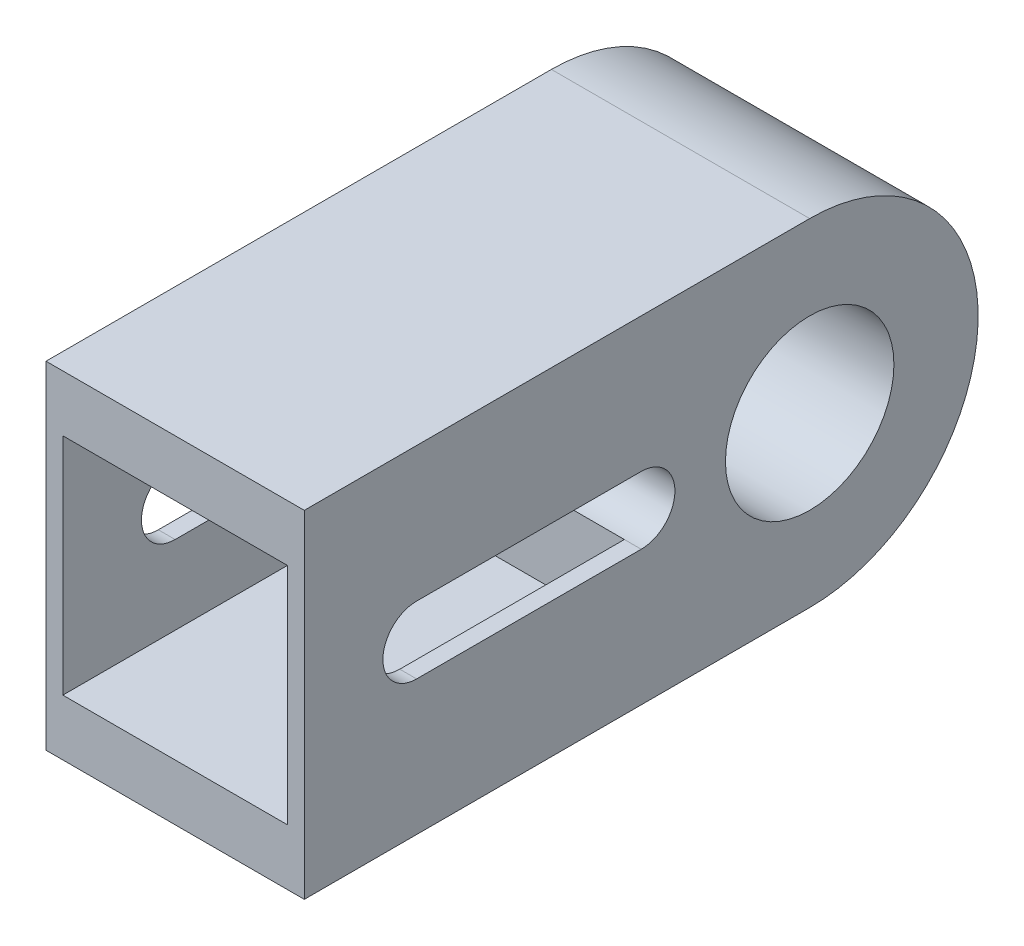
ISO-10303-21;
HEADER;
FILE_DESCRIPTION(('STEP AP214'),'2;1');
FILE_NAME('part.step','',(''),(''),'','','');
FILE_SCHEMA(('AUTOMOTIVE_DESIGN { 1 0 10303 214 1 1 1 1 }'));
ENDSEC;
DATA;
#1=APPLICATION_CONTEXT('core data for automotive mechanical design processes');
#2=APPLICATION_PROTOCOL_DEFINITION('international standard','automotive_design',2000,#1);
#3=PRODUCT_CONTEXT('',#1,'mechanical');
#4=PRODUCT('Part','Part','',(#3));
#5=PRODUCT_RELATED_PRODUCT_CATEGORY('part','',(#4));
#6=PRODUCT_DEFINITION_FORMATION('','',#4);
#7=PRODUCT_DEFINITION_CONTEXT('part definition',#1,'design');
#8=PRODUCT_DEFINITION('design','',#6,#7);
#9=PRODUCT_DEFINITION_SHAPE('','',#8);
#10=(LENGTH_UNIT() NAMED_UNIT(*) SI_UNIT(.MILLI.,.METRE.));
#11=(NAMED_UNIT(*) PLANE_ANGLE_UNIT() SI_UNIT($,.RADIAN.));
#12=(NAMED_UNIT(*) SI_UNIT($,.STERADIAN.) SOLID_ANGLE_UNIT());
#13=UNCERTAINTY_MEASURE_WITH_UNIT(LENGTH_MEASURE(1.E-05),#10,'distance_accuracy_value','');
#14=(GEOMETRIC_REPRESENTATION_CONTEXT(3) GLOBAL_UNCERTAINTY_ASSIGNED_CONTEXT((#13)) GLOBAL_UNIT_ASSIGNED_CONTEXT((#10,
#11,#12)) REPRESENTATION_CONTEXT('',''));
#15=CARTESIAN_POINT('',(0.,0.,0.));
#16=DIRECTION('',(0.,0.,1.));
#17=DIRECTION('',(1.,0.,0.));
#18=AXIS2_PLACEMENT_3D('',#15,#16,#17);
#19=CARTESIAN_POINT('',(-23.,0.,14.9535809018568));
#20=DIRECTION('',(1.,0.,0.));
#21=DIRECTION('',(0.,0.,-1.));
#22=AXIS2_PLACEMENT_3D('',#19,#20,#21);
#23=CYLINDRICAL_SURFACE('',#22,3.);
#24=DIRECTION('',(1.,0.,0.));
#25=VECTOR('',#24,1.);
#26=CARTESIAN_POINT('',(-23.,-3.,14.9535809018568));
#27=LINE('',#26,#25);
#28=CARTESIAN_POINT('',(-1.5,-3.,14.9535809018568));
#29=VERTEX_POINT('',#28);
#30=CARTESIAN_POINT('',(0.,-3.,14.9535809018568));
#31=VERTEX_POINT('',#30);
#32=EDGE_CURVE('E251',#29,#31,#27,.T.);
#33=ORIENTED_EDGE('',*,*,#32,.F.);
#34=CARTESIAN_POINT('',(-1.5,0.,14.9535809018568));
#35=DIRECTION('',(1.,0.,0.));
#36=DIRECTION('',(0.,1.,0.));
#37=AXIS2_PLACEMENT_3D('',#34,#35,#36);
#38=CIRCLE('',#37,3.);
#39=CARTESIAN_POINT('',(-1.5,3.,14.9535809018568));
#40=VERTEX_POINT('',#39);
#41=EDGE_CURVE('E218',#29,#40,#38,.F.);
#42=ORIENTED_EDGE('',*,*,#41,.T.);
#43=DIRECTION('',(1.,0.,0.));
#44=VECTOR('',#43,1.);
#45=CARTESIAN_POINT('',(-23.,3.,14.9535809018568));
#46=LINE('',#45,#44);
#47=CARTESIAN_POINT('',(0.,3.,14.9535809018568));
#48=VERTEX_POINT('',#47);
#49=EDGE_CURVE('E271',#40,#48,#46,.T.);
#50=ORIENTED_EDGE('',*,*,#49,.T.);
#51=CARTESIAN_POINT('',(0.,0.,14.9535809018568));
#52=DIRECTION('',(1.,0.,0.));
#53=DIRECTION('',(0.,0.,-1.));
#54=AXIS2_PLACEMENT_3D('',#51,#52,#53);
#55=CIRCLE('',#54,3.);
#56=EDGE_CURVE('E230',#48,#31,#55,.T.);
#57=ORIENTED_EDGE('',*,*,#56,.T.);
#58=EDGE_LOOP('',(#33,#42,#50,#57));
#59=FACE_BOUND('',#58,.T.);
#60=ADVANCED_FACE('F39',(#59),#23,.F.);
#61=CARTESIAN_POINT('',(-23.,3.,14.9535809018568));
#62=DIRECTION('',(0.,1.,0.));
#63=DIRECTION('',(0.,0.,1.));
#64=AXIS2_PLACEMENT_3D('',#61,#62,#63);
#65=PLANE('',#64);
#66=ORIENTED_EDGE('',*,*,#49,.F.);
#67=DIRECTION('',(0.,0.,-1.));
#68=VECTOR('',#67,1.);
#69=CARTESIAN_POINT('',(-1.5,3.,14.9535809018568));
#70=LINE('',#69,#68);
#71=CARTESIAN_POINT('',(-1.5,3.,-5.04641909814324));
#72=VERTEX_POINT('',#71);
#73=EDGE_CURVE('E222',#40,#72,#70,.T.);
#74=ORIENTED_EDGE('',*,*,#73,.T.);
#75=DIRECTION('',(1.,0.,0.));
#76=VECTOR('',#75,1.);
#77=CARTESIAN_POINT('',(-23.,3.,-5.04641909814324));
#78=LINE('',#77,#76);
#79=CARTESIAN_POINT('',(0.,3.,-5.04641909814324));
#80=VERTEX_POINT('',#79);
#81=EDGE_CURVE('E276',#72,#80,#78,.T.);
#82=ORIENTED_EDGE('',*,*,#81,.T.);
#83=DIRECTION('',(0.,0.,1.));
#84=VECTOR('',#83,1.);
#85=CARTESIAN_POINT('',(0.,3.,14.9535809018568));
#86=LINE('',#85,#84);
#87=EDGE_CURVE('E239',#80,#48,#86,.T.);
#88=ORIENTED_EDGE('',*,*,#87,.T.);
#89=EDGE_LOOP('',(#66,#74,#82,#88));
#90=FACE_BOUND('',#89,.T.);
#91=ADVANCED_FACE('F352',(#90),#65,.F.);
#92=CARTESIAN_POINT('',(-23.,-3.,14.9535809018568));
#93=DIRECTION('',(0.,-1.,0.));
#94=DIRECTION('',(0.,0.,-1.));
#95=AXIS2_PLACEMENT_3D('',#92,#93,#94);
#96=PLANE('',#95);
#97=DIRECTION('',(1.,0.,0.));
#98=VECTOR('',#97,1.);
#99=CARTESIAN_POINT('',(-23.,-3.,-5.04641909814324));
#100=LINE('',#99,#98);
#101=CARTESIAN_POINT('',(-1.5,-3.,-5.04641909814324));
#102=VERTEX_POINT('',#101);
#103=CARTESIAN_POINT('',(0.,-3.,-5.04641909814324));
#104=VERTEX_POINT('',#103);
#105=EDGE_CURVE('E282',#102,#104,#100,.T.);
#106=ORIENTED_EDGE('',*,*,#105,.F.);
#107=DIRECTION('',(0.,0.,1.));
#108=VECTOR('',#107,1.);
#109=CARTESIAN_POINT('',(-1.5,-3.,14.9535809018568));
#110=LINE('',#109,#108);
#111=EDGE_CURVE('E11',#102,#29,#110,.T.);
#112=ORIENTED_EDGE('',*,*,#111,.T.);
#113=ORIENTED_EDGE('',*,*,#32,.T.);
#114=DIRECTION('',(0.,0.,-1.));
#115=VECTOR('',#114,1.);
#116=CARTESIAN_POINT('',(0.,-3.,14.9535809018568));
#117=LINE('',#116,#115);
#118=EDGE_CURVE('E255',#31,#104,#117,.T.);
#119=ORIENTED_EDGE('',*,*,#118,.T.);
#120=EDGE_LOOP('',(#106,#112,#113,#119));
#121=FACE_BOUND('',#120,.T.);
#122=ADVANCED_FACE('F362',(#121),#96,.F.);
#123=CARTESIAN_POINT('',(-23.,15.,24.9535809018568));
#124=DIRECTION('',(0.,0.,1.));
#125=DIRECTION('',(0.,-1.,0.));
#126=AXIS2_PLACEMENT_3D('',#123,#124,#125);
#127=PLANE('',#126);
#128=DIRECTION('',(0.,1.,0.));
#129=VECTOR('',#128,1.);
#130=CARTESIAN_POINT('',(-1.5,10.,24.9535809018568));
#131=LINE('',#130,#129);
#132=CARTESIAN_POINT('',(-1.5,-10.,24.9535809018568));
#133=VERTEX_POINT('',#132);
#134=CARTESIAN_POINT('',(-1.5,10.,24.9535809018568));
#135=VERTEX_POINT('',#134);
#136=EDGE_CURVE('E55',#133,#135,#131,.T.);
#137=ORIENTED_EDGE('',*,*,#136,.F.);
#138=DIRECTION('',(1.,0.,0.));
#139=VECTOR('',#138,1.);
#140=CARTESIAN_POINT('',(-21.5,-10.,24.9535809018568));
#141=LINE('',#140,#139);
#142=CARTESIAN_POINT('',(-21.5,-10.,24.9535809018568));
#143=VERTEX_POINT('',#142);
#144=EDGE_CURVE('E164',#143,#133,#141,.T.);
#145=ORIENTED_EDGE('',*,*,#144,.F.);
#146=DIRECTION('',(0.,-1.,0.));
#147=VECTOR('',#146,1.);
#148=CARTESIAN_POINT('',(-21.5,10.,24.9535809018568));
#149=LINE('',#148,#147);
#150=CARTESIAN_POINT('',(-21.5,10.,24.9535809018568));
#151=VERTEX_POINT('',#150);
#152=EDGE_CURVE('E193',#151,#143,#149,.T.);
#153=ORIENTED_EDGE('',*,*,#152,.F.);
#154=DIRECTION('',(-1.,0.,0.));
#155=VECTOR('',#154,1.);
#156=CARTESIAN_POINT('',(-21.5,10.,24.9535809018568));
#157=LINE('',#156,#155);
#158=EDGE_CURVE('E190',#135,#151,#157,.T.);
#159=ORIENTED_EDGE('',*,*,#158,.F.);
#160=EDGE_LOOP('',(#137,#145,#153,#159));
#161=FACE_BOUND('',#160,.T.);
#162=DIRECTION('',(0.,-1.,0.));
#163=VECTOR('',#162,1.);
#164=CARTESIAN_POINT('',(0.,15.,24.9535809018568));
#165=LINE('',#164,#163);
#166=CARTESIAN_POINT('',(0.,15.,24.9535809018568));
#167=VERTEX_POINT('',#166);
#168=CARTESIAN_POINT('',(0.,-15.,24.9535809018568));
#169=VERTEX_POINT('',#168);
#170=EDGE_CURVE('E270',#167,#169,#165,.T.);
#171=ORIENTED_EDGE('',*,*,#170,.F.);
#172=DIRECTION('',(1.,0.,0.));
#173=VECTOR('',#172,1.);
#174=CARTESIAN_POINT('',(-23.,15.,24.9535809018568));
#175=LINE('',#174,#173);
#176=CARTESIAN_POINT('',(-23.,15.,24.9535809018568));
#177=VERTEX_POINT('',#176);
#178=EDGE_CURVE('E319',#177,#167,#175,.T.);
#179=ORIENTED_EDGE('',*,*,#178,.F.);
#180=DIRECTION('',(0.,-1.,0.));
#181=VECTOR('',#180,1.);
#182=CARTESIAN_POINT('',(-23.,15.,24.9535809018568));
#183=LINE('',#182,#181);
#184=CARTESIAN_POINT('',(-23.,-15.,24.9535809018568));
#185=VERTEX_POINT('',#184);
#186=EDGE_CURVE('E287',#177,#185,#183,.T.);
#187=ORIENTED_EDGE('',*,*,#186,.T.);
#188=DIRECTION('',(1.,0.,0.));
#189=VECTOR('',#188,1.);
#190=CARTESIAN_POINT('',(-23.,-15.,24.9535809018568));
#191=LINE('',#190,#189);
#192=EDGE_CURVE('E304',#185,#169,#191,.T.);
#193=ORIENTED_EDGE('',*,*,#192,.T.);
#194=EDGE_LOOP('',(#171,#179,#187,#193));
#195=FACE_BOUND('',#194,.T.);
#196=ADVANCED_FACE('F41',(#161,#195),#127,.T.);
#197=CARTESIAN_POINT('',(-23.,15.,24.9535809018568));
#198=DIRECTION('',(0.,1.,0.));
#199=DIRECTION('',(0.,0.,1.));
#200=AXIS2_PLACEMENT_3D('',#197,#198,#199);
#201=PLANE('',#200);
#202=DIRECTION('',(0.,0.,1.));
#203=VECTOR('',#202,1.);
#204=CARTESIAN_POINT('',(0.,15.,24.9535809018568));
#205=LINE('',#204,#203);
#206=CARTESIAN_POINT('',(0.,15.,-20.0464190981432));
#207=VERTEX_POINT('',#206);
#208=EDGE_CURVE('E292',#207,#167,#205,.T.);
#209=ORIENTED_EDGE('',*,*,#208,.F.);
#210=DIRECTION('',(1.,0.,0.));
#211=VECTOR('',#210,1.);
#212=CARTESIAN_POINT('',(-23.,15.,-20.0464190981432));
#213=LINE('',#212,#211);
#214=CARTESIAN_POINT('',(-23.,15.,-20.0464190981432));
#215=VERTEX_POINT('',#214);
#216=EDGE_CURVE('E322',#215,#207,#213,.T.);
#217=ORIENTED_EDGE('',*,*,#216,.F.);
#218=DIRECTION('',(0.,0.,1.));
#219=VECTOR('',#218,1.);
#220=CARTESIAN_POINT('',(-23.,15.,24.9535809018568));
#221=LINE('',#220,#219);
#222=EDGE_CURVE('E300',#215,#177,#221,.T.);
#223=ORIENTED_EDGE('',*,*,#222,.T.);
#224=ORIENTED_EDGE('',*,*,#178,.T.);
#225=EDGE_LOOP('',(#209,#217,#223,#224));
#226=FACE_BOUND('',#225,.T.);
#227=ADVANCED_FACE('F378',(#226),#201,.T.);
#228=CARTESIAN_POINT('',(-23.,0.,-20.0464190981432));
#229=DIRECTION('',(1.,0.,0.));
#230=DIRECTION('',(0.,0.,-1.));
#231=AXIS2_PLACEMENT_3D('',#228,#229,#230);
#232=CYLINDRICAL_SURFACE('',#231,15.);
#233=CARTESIAN_POINT('',(0.,0.,-20.0464190981432));
#234=DIRECTION('',(1.,0.,0.));
#235=DIRECTION('',(0.,0.,-1.));
#236=AXIS2_PLACEMENT_3D('',#233,#234,#235);
#237=CIRCLE('',#236,15.);
#238=CARTESIAN_POINT('',(0.,-15.,-20.0464190981432));
#239=VERTEX_POINT('',#238);
#240=EDGE_CURVE('E312',#239,#207,#237,.T.);
#241=ORIENTED_EDGE('',*,*,#240,.F.);
#242=DIRECTION('',(1.,0.,0.));
#243=VECTOR('',#242,1.);
#244=CARTESIAN_POINT('',(-23.,-15.,-20.0464190981432));
#245=LINE('',#244,#243);
#246=CARTESIAN_POINT('',(-23.,-15.,-20.0464190981432));
#247=VERTEX_POINT('',#246);
#248=EDGE_CURVE('E325',#247,#239,#245,.T.);
#249=ORIENTED_EDGE('',*,*,#248,.F.);
#250=CARTESIAN_POINT('',(-23.,0.,-20.0464190981432));
#251=DIRECTION('',(1.,0.,0.));
#252=DIRECTION('',(0.,0.,-1.));
#253=AXIS2_PLACEMENT_3D('',#250,#251,#252);
#254=CIRCLE('',#253,15.);
#255=EDGE_CURVE('E296',#247,#215,#254,.T.);
#256=ORIENTED_EDGE('',*,*,#255,.T.);
#257=ORIENTED_EDGE('',*,*,#216,.T.);
#258=EDGE_LOOP('',(#241,#249,#256,#257));
#259=FACE_BOUND('',#258,.T.);
#260=ADVANCED_FACE('F381',(#259),#232,.T.);
#261=CARTESIAN_POINT('',(-23.,-15.,24.9535809018568));
#262=DIRECTION('',(0.,-1.,0.));
#263=DIRECTION('',(0.,0.,-1.));
#264=AXIS2_PLACEMENT_3D('',#261,#262,#263);
#265=PLANE('',#264);
#266=DIRECTION('',(0.,0.,-1.));
#267=VECTOR('',#266,1.);
#268=CARTESIAN_POINT('',(0.,-15.,24.9535809018568));
#269=LINE('',#268,#267);
#270=EDGE_CURVE('E308',#169,#239,#269,.T.);
#271=ORIENTED_EDGE('',*,*,#270,.F.);
#272=ORIENTED_EDGE('',*,*,#192,.F.);
#273=DIRECTION('',(0.,0.,-1.));
#274=VECTOR('',#273,1.);
#275=CARTESIAN_POINT('',(-23.,-15.,24.9535809018568));
#276=LINE('',#275,#274);
#277=EDGE_CURVE('E291',#185,#247,#276,.T.);
#278=ORIENTED_EDGE('',*,*,#277,.T.);
#279=ORIENTED_EDGE('',*,*,#248,.T.);
#280=EDGE_LOOP('',(#271,#272,#278,#279));
#281=FACE_BOUND('',#280,.T.);
#282=ADVANCED_FACE('F373',(#281),#265,.T.);
#283=CARTESIAN_POINT('',(-23.,0.,-20.0464190981432));
#284=DIRECTION('',(1.,0.,0.));
#285=DIRECTION('',(0.,0.,-1.));
#286=AXIS2_PLACEMENT_3D('',#283,#284,#285);
#287=PLANE('',#286);
#288=CARTESIAN_POINT('',(-23.,0.,-20.0464190981432));
#289=DIRECTION('',(1.,0.,0.));
#290=DIRECTION('',(0.,0.,-1.));
#291=AXIS2_PLACEMENT_3D('',#288,#289,#290);
#292=CIRCLE('',#291,7.5);
#293=CARTESIAN_POINT('',(-23.,0.,-27.5464190981432));
#294=VERTEX_POINT('',#293);
#295=EDGE_CURVE('E226',#294,#294,#292,.T.);
#296=ORIENTED_EDGE('',*,*,#295,.T.);
#297=EDGE_LOOP('',(#296));
#298=FACE_BOUND('',#297,.T.);
#299=DIRECTION('',(0.,0.,1.));
#300=VECTOR('',#299,1.);
#301=CARTESIAN_POINT('',(-23.,3.,14.9535809018568));
#302=LINE('',#301,#300);
#303=CARTESIAN_POINT('',(-23.,3.,-5.04641909814324));
#304=VERTEX_POINT('',#303);
#305=CARTESIAN_POINT('',(-23.,3.,14.9535809018568));
#306=VERTEX_POINT('',#305);
#307=EDGE_CURVE('E247',#304,#306,#302,.T.);
#308=ORIENTED_EDGE('',*,*,#307,.T.);
#309=CARTESIAN_POINT('',(-23.,0.,14.9535809018568));
#310=DIRECTION('',(1.,0.,0.));
#311=DIRECTION('',(0.,0.,-1.));
#312=AXIS2_PLACEMENT_3D('',#309,#310,#311);
#313=CIRCLE('',#312,3.);
#314=CARTESIAN_POINT('',(-23.,-3.,14.9535809018568));
#315=VERTEX_POINT('',#314);
#316=EDGE_CURVE('E234',#306,#315,#313,.T.);
#317=ORIENTED_EDGE('',*,*,#316,.T.);
#318=DIRECTION('',(0.,0.,-1.));
#319=VECTOR('',#318,1.);
#320=CARTESIAN_POINT('',(-23.,-3.,14.9535809018568));
#321=LINE('',#320,#319);
#322=CARTESIAN_POINT('',(-23.,-3.,-5.04641909814324));
#323=VERTEX_POINT('',#322);
#324=EDGE_CURVE('E238',#315,#323,#321,.T.);
#325=ORIENTED_EDGE('',*,*,#324,.T.);
#326=CARTESIAN_POINT('',(-23.,0.,-5.04641909814324));
#327=DIRECTION('',(1.,0.,0.));
#328=DIRECTION('',(0.,0.,-1.));
#329=AXIS2_PLACEMENT_3D('',#326,#327,#328);
#330=CIRCLE('',#329,3.);
#331=EDGE_CURVE('E243',#323,#304,#330,.T.);
#332=ORIENTED_EDGE('',*,*,#331,.T.);
#333=EDGE_LOOP('',(#308,#317,#325,#332));
#334=FACE_BOUND('',#333,.T.);
#335=ORIENTED_EDGE('',*,*,#186,.F.);
#336=ORIENTED_EDGE('',*,*,#222,.F.);
#337=ORIENTED_EDGE('',*,*,#255,.F.);
#338=ORIENTED_EDGE('',*,*,#277,.F.);
#339=EDGE_LOOP('',(#335,#336,#337,#338));
#340=FACE_BOUND('',#339,.T.);
#341=ADVANCED_FACE('F342',(#298,#334,#340),#287,.F.);
#342=CARTESIAN_POINT('',(0.,0.,-20.0464190981432));
#343=DIRECTION('',(1.,0.,0.));
#344=DIRECTION('',(0.,0.,-1.));
#345=AXIS2_PLACEMENT_3D('',#342,#343,#344);
#346=PLANE('',#345);
#347=CARTESIAN_POINT('',(0.,0.,-20.0464190981432));
#348=DIRECTION('',(1.,0.,0.));
#349=DIRECTION('',(0.,0.,-1.));
#350=AXIS2_PLACEMENT_3D('',#347,#348,#349);
#351=CIRCLE('',#350,7.5);
#352=CARTESIAN_POINT('',(0.,0.,-27.5464190981432));
#353=VERTEX_POINT('',#352);
#354=EDGE_CURVE('E225',#353,#353,#351,.T.);
#355=ORIENTED_EDGE('',*,*,#354,.F.);
#356=EDGE_LOOP('',(#355));
#357=FACE_BOUND('',#356,.T.);
#358=ORIENTED_EDGE('',*,*,#56,.F.);
#359=ORIENTED_EDGE('',*,*,#87,.F.);
#360=CARTESIAN_POINT('',(0.,0.,-5.04641909814324));
#361=DIRECTION('',(1.,0.,0.));
#362=DIRECTION('',(0.,0.,-1.));
#363=AXIS2_PLACEMENT_3D('',#360,#361,#362);
#364=CIRCLE('',#363,3.);
#365=EDGE_CURVE('E259',#104,#80,#364,.T.);
#366=ORIENTED_EDGE('',*,*,#365,.F.);
#367=ORIENTED_EDGE('',*,*,#118,.F.);
#368=EDGE_LOOP('',(#358,#359,#366,#367));
#369=FACE_BOUND('',#368,.T.);
#370=ORIENTED_EDGE('',*,*,#170,.T.);
#371=ORIENTED_EDGE('',*,*,#270,.T.);
#372=ORIENTED_EDGE('',*,*,#240,.T.);
#373=ORIENTED_EDGE('',*,*,#208,.T.);
#374=EDGE_LOOP('',(#370,#371,#372,#373));
#375=FACE_BOUND('',#374,.T.);
#376=ADVANCED_FACE('F358',(#357,#369,#375),#346,.T.);
#377=CARTESIAN_POINT('',(-21.5,3.,14.9535809018568));
#378=VERTEX_POINT('',#377);
#379=EDGE_CURVE('E266',#306,#378,#46,.T.);
#380=ORIENTED_EDGE('',*,*,#379,.T.);
#381=CARTESIAN_POINT('',(-21.5,0.,14.9535809018568));
#382=DIRECTION('',(-1.,0.,0.));
#383=DIRECTION('',(0.,-1.,0.));
#384=AXIS2_PLACEMENT_3D('',#381,#382,#383);
#385=CIRCLE('',#384,3.);
#386=CARTESIAN_POINT('',(-21.5,-3.,14.9535809018568));
#387=VERTEX_POINT('',#386);
#388=EDGE_CURVE('E210',#378,#387,#385,.F.);
#389=ORIENTED_EDGE('',*,*,#388,.T.);
#390=EDGE_CURVE('E283',#315,#387,#27,.T.);
#391=ORIENTED_EDGE('',*,*,#390,.F.);
#392=ORIENTED_EDGE('',*,*,#316,.F.);
#393=EDGE_LOOP('',(#380,#389,#391,#392));
#394=FACE_BOUND('',#393,.T.);
#395=ADVANCED_FACE('F346',(#394),#23,.F.);
#396=CARTESIAN_POINT('',(-21.5,3.,-5.04641909814324));
#397=VERTEX_POINT('',#396);
#398=EDGE_CURVE('E272',#304,#397,#78,.T.);
#399=ORIENTED_EDGE('',*,*,#398,.T.);
#400=DIRECTION('',(0.,0.,1.));
#401=VECTOR('',#400,1.);
#402=CARTESIAN_POINT('',(-21.5,3.,14.9535809018568));
#403=LINE('',#402,#401);
#404=EDGE_CURVE('E214',#397,#378,#403,.T.);
#405=ORIENTED_EDGE('',*,*,#404,.T.);
#406=ORIENTED_EDGE('',*,*,#379,.F.);
#407=ORIENTED_EDGE('',*,*,#307,.F.);
#408=EDGE_LOOP('',(#399,#405,#406,#407));
#409=FACE_BOUND('',#408,.T.);
#410=ADVANCED_FACE('F349',(#409),#65,.F.);
#411=CARTESIAN_POINT('',(-23.,0.,-5.04641909814324));
#412=DIRECTION('',(1.,0.,0.));
#413=DIRECTION('',(0.,0.,-1.));
#414=AXIS2_PLACEMENT_3D('',#411,#412,#413);
#415=CYLINDRICAL_SURFACE('',#414,3.);
#416=ORIENTED_EDGE('',*,*,#365,.T.);
#417=ORIENTED_EDGE('',*,*,#81,.F.);
#418=DIRECTION('',(1.,0.,0.));
#419=VECTOR('',#418,1.);
#420=CARTESIAN_POINT('',(-23.,3.,-5.04641909814324));
#421=LINE('',#420,#419);
#422=EDGE_CURVE('E161',#397,#72,#421,.T.);
#423=ORIENTED_EDGE('',*,*,#422,.F.);
#424=ORIENTED_EDGE('',*,*,#398,.F.);
#425=ORIENTED_EDGE('',*,*,#331,.F.);
#426=CARTESIAN_POINT('',(-21.5,-3.,-5.04641909814324));
#427=VERTEX_POINT('',#426);
#428=EDGE_CURVE('E277',#323,#427,#100,.T.);
#429=ORIENTED_EDGE('',*,*,#428,.T.);
#430=EDGE_CURVE('E281',#427,#102,#100,.T.);
#431=ORIENTED_EDGE('',*,*,#430,.T.);
#432=ORIENTED_EDGE('',*,*,#105,.T.);
#433=EDGE_LOOP('',(#416,#417,#423,#424,#425,#429,#431,#432));
#434=FACE_BOUND('',#433,.T.);
#435=ADVANCED_FACE('F339',(#434),#415,.F.);
#436=ORIENTED_EDGE('',*,*,#390,.T.);
#437=DIRECTION('',(0.,0.,-1.));
#438=VECTOR('',#437,1.);
#439=CARTESIAN_POINT('',(-21.5,-3.,14.9535809018568));
#440=LINE('',#439,#438);
#441=EDGE_CURVE('E48',#387,#427,#440,.T.);
#442=ORIENTED_EDGE('',*,*,#441,.T.);
#443=ORIENTED_EDGE('',*,*,#428,.F.);
#444=ORIENTED_EDGE('',*,*,#324,.F.);
#445=EDGE_LOOP('',(#436,#442,#443,#444));
#446=FACE_BOUND('',#445,.T.);
#447=ADVANCED_FACE('F333',(#446),#96,.F.);
#448=CARTESIAN_POINT('',(-23.,0.,-20.0464190981432));
#449=DIRECTION('',(1.,0.,0.));
#450=DIRECTION('',(0.,0.,-1.));
#451=AXIS2_PLACEMENT_3D('',#448,#449,#450);
#452=CYLINDRICAL_SURFACE('',#451,7.5);
#453=ORIENTED_EDGE('',*,*,#295,.F.);
#454=EDGE_LOOP('',(#453));
#455=FACE_BOUND('',#454,.T.);
#456=ORIENTED_EDGE('',*,*,#354,.T.);
#457=EDGE_LOOP('',(#456));
#458=FACE_BOUND('',#457,.T.);
#459=ADVANCED_FACE('F437',(#455,#458),#452,.F.);
#460=CARTESIAN_POINT('',(-1.5,10.,-5.04641909814324));
#461=DIRECTION('',(1.,0.,0.));
#462=DIRECTION('',(0.,1.,0.));
#463=AXIS2_PLACEMENT_3D('',#460,#461,#462);
#464=PLANE('',#463);
#465=ORIENTED_EDGE('',*,*,#41,.F.);
#466=ORIENTED_EDGE('',*,*,#111,.F.);
#467=DIRECTION('',(0.,1.,0.));
#468=VECTOR('',#467,1.);
#469=CARTESIAN_POINT('',(-1.5,10.,-5.04641909814324));
#470=LINE('',#469,#468);
#471=CARTESIAN_POINT('',(-1.5,-10.,-5.04641909814324));
#472=VERTEX_POINT('',#471);
#473=EDGE_CURVE('E63',#472,#102,#470,.T.);
#474=ORIENTED_EDGE('',*,*,#473,.F.);
#475=DIRECTION('',(0.,0.,1.));
#476=VECTOR('',#475,1.);
#477=CARTESIAN_POINT('',(-1.5,-10.,-5.04641909814324));
#478=LINE('',#477,#476);
#479=EDGE_CURVE('E200',#472,#133,#478,.T.);
#480=ORIENTED_EDGE('',*,*,#479,.T.);
#481=ORIENTED_EDGE('',*,*,#136,.T.);
#482=DIRECTION('',(0.,0.,1.));
#483=VECTOR('',#482,1.);
#484=CARTESIAN_POINT('',(-1.5,10.,-5.04641909814324));
#485=LINE('',#484,#483);
#486=CARTESIAN_POINT('',(-1.5,10.,-5.04641909814324));
#487=VERTEX_POINT('',#486);
#488=EDGE_CURVE('E166',#487,#135,#485,.T.);
#489=ORIENTED_EDGE('',*,*,#488,.F.);
#490=EDGE_CURVE('E155',#72,#487,#470,.T.);
#491=ORIENTED_EDGE('',*,*,#490,.F.);
#492=ORIENTED_EDGE('',*,*,#73,.F.);
#493=EDGE_LOOP('',(#465,#466,#474,#480,#481,#489,#491,#492));
#494=FACE_BOUND('',#493,.T.);
#495=ADVANCED_FACE('F167',(#494),#464,.F.);
#496=CARTESIAN_POINT('',(-21.5,10.,-5.04641909814324));
#497=DIRECTION('',(-1.,0.,0.));
#498=DIRECTION('',(0.,-1.,0.));
#499=AXIS2_PLACEMENT_3D('',#496,#497,#498);
#500=PLANE('',#499);
#501=DIRECTION('',(0.,-1.,0.));
#502=VECTOR('',#501,1.);
#503=CARTESIAN_POINT('',(-21.5,10.,-5.04641909814324));
#504=LINE('',#503,#502);
#505=CARTESIAN_POINT('',(-21.5,10.,-5.04641909814324));
#506=VERTEX_POINT('',#505);
#507=EDGE_CURVE('E182',#506,#397,#504,.T.);
#508=ORIENTED_EDGE('',*,*,#507,.F.);
#509=DIRECTION('',(0.,0.,1.));
#510=VECTOR('',#509,1.);
#511=CARTESIAN_POINT('',(-21.5,10.,-5.04641909814324));
#512=LINE('',#511,#510);
#513=EDGE_CURVE('E172',#506,#151,#512,.T.);
#514=ORIENTED_EDGE('',*,*,#513,.T.);
#515=ORIENTED_EDGE('',*,*,#152,.T.);
#516=DIRECTION('',(0.,0.,1.));
#517=VECTOR('',#516,1.);
#518=CARTESIAN_POINT('',(-21.5,-10.,-5.04641909814324));
#519=LINE('',#518,#517);
#520=CARTESIAN_POINT('',(-21.5,-10.,-5.04641909814324));
#521=VERTEX_POINT('',#520);
#522=EDGE_CURVE('E203',#521,#143,#519,.T.);
#523=ORIENTED_EDGE('',*,*,#522,.F.);
#524=EDGE_CURVE('E178',#427,#521,#504,.T.);
#525=ORIENTED_EDGE('',*,*,#524,.F.);
#526=ORIENTED_EDGE('',*,*,#441,.F.);
#527=ORIENTED_EDGE('',*,*,#388,.F.);
#528=ORIENTED_EDGE('',*,*,#404,.F.);
#529=EDGE_LOOP('',(#508,#514,#515,#523,#525,#526,#527,#528));
#530=FACE_BOUND('',#529,.T.);
#531=ADVANCED_FACE('F347',(#530),#500,.F.);
#532=CARTESIAN_POINT('',(0.,0.,-5.04641909814324));
#533=DIRECTION('',(0.,0.,1.));
#534=DIRECTION('',(1.,0.,0.));
#535=AXIS2_PLACEMENT_3D('',#532,#533,#534);
#536=PLANE('',#535);
#537=ORIENTED_EDGE('',*,*,#422,.T.);
#538=ORIENTED_EDGE('',*,*,#490,.T.);
#539=DIRECTION('',(-1.,0.,0.));
#540=VECTOR('',#539,1.);
#541=CARTESIAN_POINT('',(-21.5,10.,-5.04641909814324));
#542=LINE('',#541,#540);
#543=EDGE_CURVE('E159',#487,#506,#542,.T.);
#544=ORIENTED_EDGE('',*,*,#543,.T.);
#545=ORIENTED_EDGE('',*,*,#507,.T.);
#546=EDGE_LOOP('',(#537,#538,#544,#545));
#547=FACE_BOUND('',#546,.T.);
#548=ADVANCED_FACE('F156',(#547),#536,.T.);
#549=ORIENTED_EDGE('',*,*,#430,.F.);
#550=ORIENTED_EDGE('',*,*,#524,.T.);
#551=DIRECTION('',(1.,0.,0.));
#552=VECTOR('',#551,1.);
#553=CARTESIAN_POINT('',(-21.5,-10.,-5.04641909814324));
#554=LINE('',#553,#552);
#555=EDGE_CURVE('E173',#521,#472,#554,.T.);
#556=ORIENTED_EDGE('',*,*,#555,.T.);
#557=ORIENTED_EDGE('',*,*,#473,.T.);
#558=EDGE_LOOP('',(#549,#550,#556,#557));
#559=FACE_BOUND('',#558,.T.);
#560=ADVANCED_FACE('F422',(#559),#536,.T.);
#561=CARTESIAN_POINT('',(-21.5,-10.,-5.04641909814324));
#562=DIRECTION('',(0.,-1.,0.));
#563=DIRECTION('',(0.,0.,-1.));
#564=AXIS2_PLACEMENT_3D('',#561,#562,#563);
#565=PLANE('',#564);
#566=ORIENTED_EDGE('',*,*,#144,.T.);
#567=ORIENTED_EDGE('',*,*,#479,.F.);
#568=ORIENTED_EDGE('',*,*,#555,.F.);
#569=ORIENTED_EDGE('',*,*,#522,.T.);
#570=EDGE_LOOP('',(#566,#567,#568,#569));
#571=FACE_BOUND('',#570,.T.);
#572=ADVANCED_FACE('F424',(#571),#565,.F.);
#573=CARTESIAN_POINT('',(-21.5,10.,-5.04641909814324));
#574=DIRECTION('',(0.,1.,0.));
#575=DIRECTION('',(0.,0.,1.));
#576=AXIS2_PLACEMENT_3D('',#573,#574,#575);
#577=PLANE('',#576);
#578=ORIENTED_EDGE('',*,*,#158,.T.);
#579=ORIENTED_EDGE('',*,*,#513,.F.);
#580=ORIENTED_EDGE('',*,*,#543,.F.);
#581=ORIENTED_EDGE('',*,*,#488,.T.);
#582=EDGE_LOOP('',(#578,#579,#580,#581));
#583=FACE_BOUND('',#582,.T.);
#584=ADVANCED_FACE('F175',(#583),#577,.F.);
#585=CLOSED_SHELL('',(#60,#91,#122,#196,#227,#260,#282,#341,#376,#395,#410,#435,#447,#459,#495,
#531,#548,#560,#572,#584));
#586=MANIFOLD_SOLID_BREP('B2',#585);
#587=ADVANCED_BREP_SHAPE_REPRESENTATION('',(#18,#586),#14);
#588=SHAPE_DEFINITION_REPRESENTATION(#9,#587);
ENDSEC;
END-ISO-10303-21;
